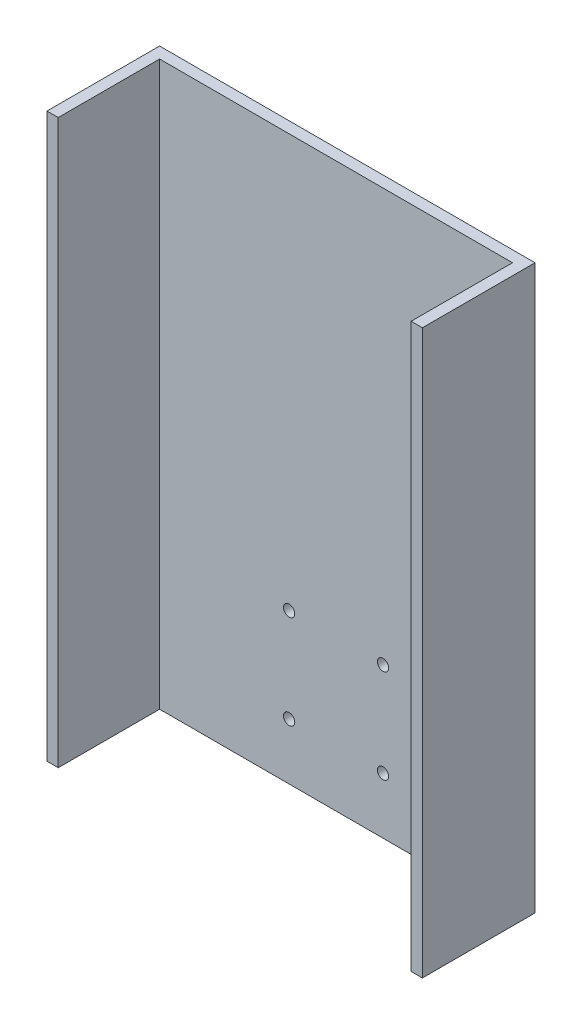
ISO-10303-21;
HEADER;
FILE_DESCRIPTION(('STEP AP214'),'2;1');
FILE_NAME('part.step','',(''),(''),'','','');
FILE_SCHEMA(('AUTOMOTIVE_DESIGN { 1 0 10303 214 1 1 1 1 }'));
ENDSEC;
DATA;
#1=APPLICATION_CONTEXT('core data for automotive mechanical design processes');
#2=APPLICATION_PROTOCOL_DEFINITION('international standard','automotive_design',2000,#1);
#3=PRODUCT_CONTEXT('',#1,'mechanical');
#4=PRODUCT('Part','Part','',(#3));
#5=PRODUCT_RELATED_PRODUCT_CATEGORY('part','',(#4));
#6=PRODUCT_DEFINITION_FORMATION('','',#4);
#7=PRODUCT_DEFINITION_CONTEXT('part definition',#1,'design');
#8=PRODUCT_DEFINITION('design','',#6,#7);
#9=PRODUCT_DEFINITION_SHAPE('','',#8);
#10=(LENGTH_UNIT() NAMED_UNIT(*) SI_UNIT(.MILLI.,.METRE.));
#11=(NAMED_UNIT(*) PLANE_ANGLE_UNIT() SI_UNIT($,.RADIAN.));
#12=(NAMED_UNIT(*) SI_UNIT($,.STERADIAN.) SOLID_ANGLE_UNIT());
#13=UNCERTAINTY_MEASURE_WITH_UNIT(LENGTH_MEASURE(1.E-05),#10,'distance_accuracy_value','');
#14=(GEOMETRIC_REPRESENTATION_CONTEXT(3) GLOBAL_UNCERTAINTY_ASSIGNED_CONTEXT((#13)) GLOBAL_UNIT_ASSIGNED_CONTEXT((#10,
#11,#12)) REPRESENTATION_CONTEXT('',''));
#15=CARTESIAN_POINT('',(0.,0.,0.));
#16=DIRECTION('',(0.,0.,1.));
#17=DIRECTION('',(1.,0.,0.));
#18=AXIS2_PLACEMENT_3D('',#15,#16,#17);
#19=CARTESIAN_POINT('',(0.,0.,30.));
#20=DIRECTION('',(0.,0.,1.));
#21=DIRECTION('',(1.,0.,0.));
#22=AXIS2_PLACEMENT_3D('',#19,#20,#21);
#23=PLANE('',#22);
#24=DIRECTION('',(0.,-1.,0.));
#25=VECTOR('',#24,1.);
#26=CARTESIAN_POINT('',(-47.,-75.,30.));
#27=LINE('',#26,#25);
#28=CARTESIAN_POINT('',(-47.,75.,30.));
#29=VERTEX_POINT('',#28);
#30=CARTESIAN_POINT('',(-47.,-75.,30.));
#31=VERTEX_POINT('',#30);
#32=EDGE_CURVE('E114',#29,#31,#27,.T.);
#33=ORIENTED_EDGE('',*,*,#32,.F.);
#34=DIRECTION('',(-1.,0.,0.));
#35=VECTOR('',#34,1.);
#36=CARTESIAN_POINT('',(50.,75.,30.));
#37=LINE('',#36,#35);
#38=CARTESIAN_POINT('',(-50.,75.,30.));
#39=VERTEX_POINT('',#38);
#40=EDGE_CURVE('E57',#29,#39,#37,.T.);
#41=ORIENTED_EDGE('',*,*,#40,.T.);
#42=DIRECTION('',(0.,-1.,0.));
#43=VECTOR('',#42,1.);
#44=CARTESIAN_POINT('',(-50.,-75.,30.));
#45=LINE('',#44,#43);
#46=CARTESIAN_POINT('',(-50.,-75.,30.));
#47=VERTEX_POINT('',#46);
#48=EDGE_CURVE('E141',#39,#47,#45,.T.);
#49=ORIENTED_EDGE('',*,*,#48,.T.);
#50=DIRECTION('',(1.,0.,0.));
#51=VECTOR('',#50,1.);
#52=CARTESIAN_POINT('',(50.,-75.,30.));
#53=LINE('',#52,#51);
#54=EDGE_CURVE('E86',#47,#31,#53,.T.);
#55=ORIENTED_EDGE('',*,*,#54,.T.);
#56=EDGE_LOOP('',(#33,#41,#49,#55));
#57=FACE_BOUND('',#56,.T.);
#58=ADVANCED_FACE('F33',(#57),#23,.T.);
#59=CARTESIAN_POINT('',(-50.,-75.,30.));
#60=DIRECTION('',(1.,0.,0.));
#61=DIRECTION('',(0.,0.,-1.));
#62=AXIS2_PLACEMENT_3D('',#59,#60,#61);
#63=PLANE('',#62);
#64=DIRECTION('',(0.,-1.,0.));
#65=VECTOR('',#64,1.);
#66=CARTESIAN_POINT('',(-50.,-75.,0.));
#67=LINE('',#66,#65);
#68=CARTESIAN_POINT('',(-50.,75.,0.));
#69=VERTEX_POINT('',#68);
#70=CARTESIAN_POINT('',(-50.,-75.,0.));
#71=VERTEX_POINT('',#70);
#72=EDGE_CURVE('E116',#69,#71,#67,.T.);
#73=ORIENTED_EDGE('',*,*,#72,.T.);
#74=DIRECTION('',(0.,0.,-1.));
#75=VECTOR('',#74,1.);
#76=CARTESIAN_POINT('',(-50.,-75.,30.));
#77=LINE('',#76,#75);
#78=EDGE_CURVE('E11',#47,#71,#77,.T.);
#79=ORIENTED_EDGE('',*,*,#78,.F.);
#80=ORIENTED_EDGE('',*,*,#48,.F.);
#81=DIRECTION('',(0.,0.,-1.));
#82=VECTOR('',#81,1.);
#83=CARTESIAN_POINT('',(-50.,75.,30.));
#84=LINE('',#83,#82);
#85=EDGE_CURVE('E150',#39,#69,#84,.T.);
#86=ORIENTED_EDGE('',*,*,#85,.T.);
#87=EDGE_LOOP('',(#73,#79,#80,#86));
#88=FACE_BOUND('',#87,.T.);
#89=ADVANCED_FACE('F35',(#88),#63,.F.);
#90=CARTESIAN_POINT('',(50.,-75.,30.));
#91=DIRECTION('',(0.,1.,0.));
#92=DIRECTION('',(0.,0.,1.));
#93=AXIS2_PLACEMENT_3D('',#90,#91,#92);
#94=PLANE('',#93);
#95=CARTESIAN_POINT('',(47.,-75.,30.));
#96=VERTEX_POINT('',#95);
#97=CARTESIAN_POINT('',(50.,-75.,30.));
#98=VERTEX_POINT('',#97);
#99=EDGE_CURVE('E143',#96,#98,#53,.T.);
#100=ORIENTED_EDGE('',*,*,#99,.F.);
#101=DIRECTION('',(0.,0.,-1.));
#102=VECTOR('',#101,1.);
#103=CARTESIAN_POINT('',(47.,-75.,30.));
#104=LINE('',#103,#102);
#105=CARTESIAN_POINT('',(47.,-75.,3.));
#106=VERTEX_POINT('',#105);
#107=EDGE_CURVE('E48',#96,#106,#104,.T.);
#108=ORIENTED_EDGE('',*,*,#107,.T.);
#109=DIRECTION('',(1.,0.,0.));
#110=VECTOR('',#109,1.);
#111=CARTESIAN_POINT('',(50.,-75.,3.));
#112=LINE('',#111,#110);
#113=CARTESIAN_POINT('',(-47.,-75.,3.));
#114=VERTEX_POINT('',#113);
#115=EDGE_CURVE('E120',#114,#106,#112,.T.);
#116=ORIENTED_EDGE('',*,*,#115,.F.);
#117=DIRECTION('',(0.,0.,-1.));
#118=VECTOR('',#117,1.);
#119=CARTESIAN_POINT('',(-47.,-75.,30.));
#120=LINE('',#119,#118);
#121=EDGE_CURVE('E109',#31,#114,#120,.T.);
#122=ORIENTED_EDGE('',*,*,#121,.F.);
#123=ORIENTED_EDGE('',*,*,#54,.F.);
#124=ORIENTED_EDGE('',*,*,#78,.T.);
#125=DIRECTION('',(1.,0.,0.));
#126=VECTOR('',#125,1.);
#127=CARTESIAN_POINT('',(50.,-75.,0.));
#128=LINE('',#127,#126);
#129=CARTESIAN_POINT('',(50.,-75.,0.));
#130=VERTEX_POINT('',#129);
#131=EDGE_CURVE('E153',#71,#130,#128,.T.);
#132=ORIENTED_EDGE('',*,*,#131,.T.);
#133=DIRECTION('',(0.,0.,-1.));
#134=VECTOR('',#133,1.);
#135=CARTESIAN_POINT('',(50.,-75.,30.));
#136=LINE('',#135,#134);
#137=EDGE_CURVE('E41',#98,#130,#136,.T.);
#138=ORIENTED_EDGE('',*,*,#137,.F.);
#139=EDGE_LOOP('',(#100,#108,#116,#122,#123,#124,#132,#138));
#140=FACE_BOUND('',#139,.T.);
#141=ADVANCED_FACE('F126',(#140),#94,.F.);
#142=CARTESIAN_POINT('',(50.,-75.,30.));
#143=DIRECTION('',(-1.,0.,0.));
#144=DIRECTION('',(0.,0.,1.));
#145=AXIS2_PLACEMENT_3D('',#142,#143,#144);
#146=PLANE('',#145);
#147=DIRECTION('',(0.,1.,0.));
#148=VECTOR('',#147,1.);
#149=CARTESIAN_POINT('',(50.,-75.,0.));
#150=LINE('',#149,#148);
#151=CARTESIAN_POINT('',(50.,75.,0.));
#152=VERTEX_POINT('',#151);
#153=EDGE_CURVE('E155',#130,#152,#150,.T.);
#154=ORIENTED_EDGE('',*,*,#153,.T.);
#155=DIRECTION('',(0.,0.,-1.));
#156=VECTOR('',#155,1.);
#157=CARTESIAN_POINT('',(50.,75.,30.));
#158=LINE('',#157,#156);
#159=CARTESIAN_POINT('',(50.,75.,30.));
#160=VERTEX_POINT('',#159);
#161=EDGE_CURVE('E159',#160,#152,#158,.T.);
#162=ORIENTED_EDGE('',*,*,#161,.F.);
#163=DIRECTION('',(0.,1.,0.));
#164=VECTOR('',#163,1.);
#165=CARTESIAN_POINT('',(50.,-75.,30.));
#166=LINE('',#165,#164);
#167=EDGE_CURVE('E145',#98,#160,#166,.T.);
#168=ORIENTED_EDGE('',*,*,#167,.F.);
#169=ORIENTED_EDGE('',*,*,#137,.T.);
#170=EDGE_LOOP('',(#154,#162,#168,#169));
#171=FACE_BOUND('',#170,.T.);
#172=ADVANCED_FACE('F165',(#171),#146,.F.);
#173=CARTESIAN_POINT('',(50.,75.,30.));
#174=DIRECTION('',(0.,-1.,0.));
#175=DIRECTION('',(1.,0.,0.));
#176=AXIS2_PLACEMENT_3D('',#173,#174,#175);
#177=PLANE('',#176);
#178=ORIENTED_EDGE('',*,*,#40,.F.);
#179=DIRECTION('',(0.,0.,-1.));
#180=VECTOR('',#179,1.);
#181=CARTESIAN_POINT('',(-47.,75.,30.));
#182=LINE('',#181,#180);
#183=CARTESIAN_POINT('',(-47.,75.,3.));
#184=VERTEX_POINT('',#183);
#185=EDGE_CURVE('E135',#29,#184,#182,.T.);
#186=ORIENTED_EDGE('',*,*,#185,.T.);
#187=DIRECTION('',(-1.,0.,0.));
#188=VECTOR('',#187,1.);
#189=CARTESIAN_POINT('',(50.,75.,3.));
#190=LINE('',#189,#188);
#191=CARTESIAN_POINT('',(47.,75.,3.));
#192=VERTEX_POINT('',#191);
#193=EDGE_CURVE('E122',#192,#184,#190,.T.);
#194=ORIENTED_EDGE('',*,*,#193,.F.);
#195=DIRECTION('',(0.,0.,-1.));
#196=VECTOR('',#195,1.);
#197=CARTESIAN_POINT('',(47.,75.,30.));
#198=LINE('',#197,#196);
#199=CARTESIAN_POINT('',(47.,75.,30.));
#200=VERTEX_POINT('',#199);
#201=EDGE_CURVE('E132',#200,#192,#198,.T.);
#202=ORIENTED_EDGE('',*,*,#201,.F.);
#203=EDGE_CURVE('E147',#160,#200,#37,.T.);
#204=ORIENTED_EDGE('',*,*,#203,.F.);
#205=ORIENTED_EDGE('',*,*,#161,.T.);
#206=DIRECTION('',(-1.,0.,0.));
#207=VECTOR('',#206,1.);
#208=CARTESIAN_POINT('',(50.,75.,0.));
#209=LINE('',#208,#207);
#210=EDGE_CURVE('E79',#152,#69,#209,.T.);
#211=ORIENTED_EDGE('',*,*,#210,.T.);
#212=ORIENTED_EDGE('',*,*,#85,.F.);
#213=EDGE_LOOP('',(#178,#186,#194,#202,#204,#205,#211,#212));
#214=FACE_BOUND('',#213,.T.);
#215=ADVANCED_FACE('F173',(#214),#177,.F.);
#216=DIRECTION('',(0.,1.,0.));
#217=VECTOR('',#216,1.);
#218=CARTESIAN_POINT('',(47.,-75.,30.));
#219=LINE('',#218,#217);
#220=EDGE_CURVE('E133',#96,#200,#219,.T.);
#221=ORIENTED_EDGE('',*,*,#220,.F.);
#222=ORIENTED_EDGE('',*,*,#99,.T.);
#223=ORIENTED_EDGE('',*,*,#167,.T.);
#224=ORIENTED_EDGE('',*,*,#203,.T.);
#225=EDGE_LOOP('',(#221,#222,#223,#224));
#226=FACE_BOUND('',#225,.T.);
#227=ADVANCED_FACE('F177',(#226),#23,.T.);
#228=CARTESIAN_POINT('',(0.,0.,0.));
#229=DIRECTION('',(0.,0.,1.));
#230=DIRECTION('',(1.,0.,0.));
#231=AXIS2_PLACEMENT_3D('',#228,#229,#230);
#232=PLANE('',#231);
#233=CARTESIAN_POINT('',(12.5,-35.,0.));
#234=DIRECTION('',(0.,0.,1.));
#235=DIRECTION('',(1.,0.,0.));
#236=AXIS2_PLACEMENT_3D('',#233,#234,#235);
#237=CIRCLE('',#236,1.5);
#238=CARTESIAN_POINT('',(14.,-35.,0.));
#239=VERTEX_POINT('',#238);
#240=EDGE_CURVE('E237',#239,#239,#237,.F.);
#241=ORIENTED_EDGE('',*,*,#240,.F.);
#242=EDGE_LOOP('',(#241));
#243=FACE_BOUND('',#242,.T.);
#244=CARTESIAN_POINT('',(12.5,-60.,0.));
#245=DIRECTION('',(0.,0.,1.));
#246=DIRECTION('',(1.,0.,0.));
#247=AXIS2_PLACEMENT_3D('',#244,#245,#246);
#248=CIRCLE('',#247,1.5);
#249=CARTESIAN_POINT('',(14.,-60.,0.));
#250=VERTEX_POINT('',#249);
#251=EDGE_CURVE('E231',#250,#250,#248,.F.);
#252=ORIENTED_EDGE('',*,*,#251,.F.);
#253=EDGE_LOOP('',(#252));
#254=FACE_BOUND('',#253,.T.);
#255=CARTESIAN_POINT('',(-12.5,-60.,0.));
#256=DIRECTION('',(0.,0.,1.));
#257=DIRECTION('',(1.,0.,0.));
#258=AXIS2_PLACEMENT_3D('',#255,#256,#257);
#259=CIRCLE('',#258,1.5);
#260=CARTESIAN_POINT('',(-11.,-60.,0.));
#261=VERTEX_POINT('',#260);
#262=EDGE_CURVE('E225',#261,#261,#259,.F.);
#263=ORIENTED_EDGE('',*,*,#262,.F.);
#264=EDGE_LOOP('',(#263));
#265=FACE_BOUND('',#264,.T.);
#266=CARTESIAN_POINT('',(-12.5,-35.,0.));
#267=DIRECTION('',(0.,0.,1.));
#268=DIRECTION('',(1.,0.,0.));
#269=AXIS2_PLACEMENT_3D('',#266,#267,#268);
#270=CIRCLE('',#269,1.5);
#271=CARTESIAN_POINT('',(-11.,-35.,0.));
#272=VERTEX_POINT('',#271);
#273=EDGE_CURVE('E123',#272,#272,#270,.F.);
#274=ORIENTED_EDGE('',*,*,#273,.F.);
#275=EDGE_LOOP('',(#274));
#276=FACE_BOUND('',#275,.T.);
#277=ORIENTED_EDGE('',*,*,#72,.F.);
#278=ORIENTED_EDGE('',*,*,#210,.F.);
#279=ORIENTED_EDGE('',*,*,#153,.F.);
#280=ORIENTED_EDGE('',*,*,#131,.F.);
#281=EDGE_LOOP('',(#277,#278,#279,#280));
#282=FACE_BOUND('',#281,.T.);
#283=ADVANCED_FACE('F169',(#243,#254,#265,#276,#282),#232,.F.);
#284=CARTESIAN_POINT('',(-47.,-75.,30.));
#285=DIRECTION('',(1.,0.,0.));
#286=DIRECTION('',(0.,0.,-1.));
#287=AXIS2_PLACEMENT_3D('',#284,#285,#286);
#288=PLANE('',#287);
#289=DIRECTION('',(0.,-1.,0.));
#290=VECTOR('',#289,1.);
#291=CARTESIAN_POINT('',(-47.,-75.,3.));
#292=LINE('',#291,#290);
#293=EDGE_CURVE('E112',#184,#114,#292,.T.);
#294=ORIENTED_EDGE('',*,*,#293,.F.);
#295=ORIENTED_EDGE('',*,*,#185,.F.);
#296=ORIENTED_EDGE('',*,*,#32,.T.);
#297=ORIENTED_EDGE('',*,*,#121,.T.);
#298=EDGE_LOOP('',(#294,#295,#296,#297));
#299=FACE_BOUND('',#298,.T.);
#300=ADVANCED_FACE('F111',(#299),#288,.T.);
#301=CARTESIAN_POINT('',(47.,-75.,30.));
#302=DIRECTION('',(-1.,0.,0.));
#303=DIRECTION('',(0.,0.,1.));
#304=AXIS2_PLACEMENT_3D('',#301,#302,#303);
#305=PLANE('',#304);
#306=DIRECTION('',(0.,1.,0.));
#307=VECTOR('',#306,1.);
#308=CARTESIAN_POINT('',(47.,-75.,3.));
#309=LINE('',#308,#307);
#310=EDGE_CURVE('E127',#106,#192,#309,.T.);
#311=ORIENTED_EDGE('',*,*,#310,.F.);
#312=ORIENTED_EDGE('',*,*,#107,.F.);
#313=ORIENTED_EDGE('',*,*,#220,.T.);
#314=ORIENTED_EDGE('',*,*,#201,.T.);
#315=EDGE_LOOP('',(#311,#312,#313,#314));
#316=FACE_BOUND('',#315,.T.);
#317=ADVANCED_FACE('F192',(#316),#305,.T.);
#318=CARTESIAN_POINT('',(0.,0.,3.));
#319=DIRECTION('',(0.,0.,1.));
#320=DIRECTION('',(1.,0.,0.));
#321=AXIS2_PLACEMENT_3D('',#318,#319,#320);
#322=PLANE('',#321);
#323=CARTESIAN_POINT('',(12.5,-35.,3.));
#324=DIRECTION('',(0.,0.,1.));
#325=DIRECTION('',(-1.,0.,0.));
#326=AXIS2_PLACEMENT_3D('',#323,#324,#325);
#327=CIRCLE('',#326,1.5);
#328=CARTESIAN_POINT('',(14.,-35.,3.));
#329=VERTEX_POINT('',#328);
#330=EDGE_CURVE('E240',#329,#329,#327,.T.);
#331=ORIENTED_EDGE('',*,*,#330,.F.);
#332=EDGE_LOOP('',(#331));
#333=FACE_BOUND('',#332,.T.);
#334=CARTESIAN_POINT('',(12.5,-60.,3.));
#335=DIRECTION('',(0.,0.,1.));
#336=DIRECTION('',(-1.,0.,0.));
#337=AXIS2_PLACEMENT_3D('',#334,#335,#336);
#338=CIRCLE('',#337,1.5);
#339=CARTESIAN_POINT('',(14.,-60.,3.));
#340=VERTEX_POINT('',#339);
#341=EDGE_CURVE('E234',#340,#340,#338,.T.);
#342=ORIENTED_EDGE('',*,*,#341,.F.);
#343=EDGE_LOOP('',(#342));
#344=FACE_BOUND('',#343,.T.);
#345=CARTESIAN_POINT('',(-12.5,-60.,3.));
#346=DIRECTION('',(0.,0.,1.));
#347=DIRECTION('',(1.,0.,0.));
#348=AXIS2_PLACEMENT_3D('',#345,#346,#347);
#349=CIRCLE('',#348,1.5);
#350=CARTESIAN_POINT('',(-11.,-60.,3.));
#351=VERTEX_POINT('',#350);
#352=EDGE_CURVE('E222',#351,#351,#349,.T.);
#353=ORIENTED_EDGE('',*,*,#352,.F.);
#354=EDGE_LOOP('',(#353));
#355=FACE_BOUND('',#354,.T.);
#356=CARTESIAN_POINT('',(-12.5,-35.,3.));
#357=DIRECTION('',(0.,0.,1.));
#358=DIRECTION('',(1.,0.,0.));
#359=AXIS2_PLACEMENT_3D('',#356,#357,#358);
#360=CIRCLE('',#359,1.5);
#361=CARTESIAN_POINT('',(-11.,-35.,3.));
#362=VERTEX_POINT('',#361);
#363=EDGE_CURVE('E227',#362,#362,#360,.T.);
#364=ORIENTED_EDGE('',*,*,#363,.F.);
#365=EDGE_LOOP('',(#364));
#366=FACE_BOUND('',#365,.T.);
#367=ORIENTED_EDGE('',*,*,#293,.T.);
#368=ORIENTED_EDGE('',*,*,#115,.T.);
#369=ORIENTED_EDGE('',*,*,#310,.T.);
#370=ORIENTED_EDGE('',*,*,#193,.T.);
#371=EDGE_LOOP('',(#367,#368,#369,#370));
#372=FACE_BOUND('',#371,.T.);
#373=ADVANCED_FACE('F119',(#333,#344,#355,#366,#372),#322,.T.);
#374=CARTESIAN_POINT('',(-12.5,-35.,-0.00100000000000013));
#375=DIRECTION('',(0.,0.,1.));
#376=DIRECTION('',(1.,0.,0.));
#377=AXIS2_PLACEMENT_3D('',#374,#375,#376);
#378=CYLINDRICAL_SURFACE('',#377,1.5);
#379=CARTESIAN_POINT('',(-11.,-35.,3.));
#380=CARTESIAN_POINT('',(-11.,-35.,2.96875));
#381=CARTESIAN_POINT('',(-11.,-35.,2.9375));
#382=CARTESIAN_POINT('',(-11.,-35.,2.875));
#383=CARTESIAN_POINT('',(-11.,-35.,2.84375));
#384=CARTESIAN_POINT('',(-11.,-35.,2.78125));
#385=CARTESIAN_POINT('',(-11.,-35.,2.75));
#386=CARTESIAN_POINT('',(-11.,-35.,2.6875));
#387=CARTESIAN_POINT('',(-11.,-35.,2.65625));
#388=CARTESIAN_POINT('',(-11.,-35.,2.59375));
#389=CARTESIAN_POINT('',(-11.,-35.,2.5625));
#390=CARTESIAN_POINT('',(-11.,-35.,2.5));
#391=CARTESIAN_POINT('',(-11.,-35.,2.46875));
#392=CARTESIAN_POINT('',(-11.,-35.,2.40625));
#393=CARTESIAN_POINT('',(-11.,-35.,2.375));
#394=CARTESIAN_POINT('',(-11.,-35.,2.3125));
#395=CARTESIAN_POINT('',(-11.,-35.,2.28125));
#396=CARTESIAN_POINT('',(-11.,-35.,2.21875));
#397=CARTESIAN_POINT('',(-11.,-35.,2.1875));
#398=CARTESIAN_POINT('',(-11.,-35.,2.125));
#399=CARTESIAN_POINT('',(-11.,-35.,2.09375));
#400=CARTESIAN_POINT('',(-11.,-35.,2.03125));
#401=CARTESIAN_POINT('',(-11.,-35.,2.));
#402=CARTESIAN_POINT('',(-11.,-35.,1.9375));
#403=CARTESIAN_POINT('',(-11.,-35.,1.90625));
#404=CARTESIAN_POINT('',(-11.,-35.,1.84375));
#405=CARTESIAN_POINT('',(-11.,-35.,1.8125));
#406=CARTESIAN_POINT('',(-11.,-35.,1.75));
#407=CARTESIAN_POINT('',(-11.,-35.,1.71875));
#408=CARTESIAN_POINT('',(-11.,-35.,1.65625));
#409=CARTESIAN_POINT('',(-11.,-35.,1.625));
#410=CARTESIAN_POINT('',(-11.,-35.,1.5625));
#411=CARTESIAN_POINT('',(-11.,-35.,1.53125));
#412=CARTESIAN_POINT('',(-11.,-35.,1.46875));
#413=CARTESIAN_POINT('',(-11.,-35.,1.4375));
#414=CARTESIAN_POINT('',(-11.,-35.,1.375));
#415=CARTESIAN_POINT('',(-11.,-35.,1.34375));
#416=CARTESIAN_POINT('',(-11.,-35.,1.28125));
#417=CARTESIAN_POINT('',(-11.,-35.,1.25));
#418=CARTESIAN_POINT('',(-11.,-35.,1.1875));
#419=CARTESIAN_POINT('',(-11.,-35.,1.15625));
#420=CARTESIAN_POINT('',(-11.,-35.,1.09375));
#421=CARTESIAN_POINT('',(-11.,-35.,1.0625));
#422=CARTESIAN_POINT('',(-11.,-35.,1.));
#423=CARTESIAN_POINT('',(-11.,-35.,0.96875));
#424=CARTESIAN_POINT('',(-11.,-35.,0.90625));
#425=CARTESIAN_POINT('',(-11.,-35.,0.875));
#426=CARTESIAN_POINT('',(-11.,-35.,0.8125));
#427=CARTESIAN_POINT('',(-11.,-35.,0.78125));
#428=CARTESIAN_POINT('',(-11.,-35.,0.71875));
#429=CARTESIAN_POINT('',(-11.,-35.,0.6875));
#430=CARTESIAN_POINT('',(-11.,-35.,0.625));
#431=CARTESIAN_POINT('',(-11.,-35.,0.59375));
#432=CARTESIAN_POINT('',(-11.,-35.,0.53125));
#433=CARTESIAN_POINT('',(-11.,-35.,0.5));
#434=CARTESIAN_POINT('',(-11.,-35.,0.4375));
#435=CARTESIAN_POINT('',(-11.,-35.,0.40625));
#436=CARTESIAN_POINT('',(-11.,-35.,0.34375));
#437=CARTESIAN_POINT('',(-11.,-35.,0.3125));
#438=CARTESIAN_POINT('',(-11.,-35.,0.25));
#439=CARTESIAN_POINT('',(-11.,-35.,0.21875));
#440=CARTESIAN_POINT('',(-11.,-35.,0.15625));
#441=CARTESIAN_POINT('',(-11.,-35.,0.125));
#442=CARTESIAN_POINT('',(-11.,-35.,0.0625000000000001));
#443=CARTESIAN_POINT('',(-11.,-35.,0.0312500000000001));
#444=CARTESIAN_POINT('',(-11.,-35.,0.));
#445=B_SPLINE_CURVE_WITH_KNOTS('',3,(#379,#380,#381,#382,#383,#384,#385,#386,#387,#388,#389,
#390,#391,#392,#393,#394,#395,#396,#397,#398,#399,#400,#401,#402,#403,#404,#405,#406,#407,#408,
#409,#410,#411,#412,#413,#414,#415,#416,#417,#418,#419,#420,#421,#422,#423,#424,#425,#426,#427,
#428,#429,#430,#431,#432,#433,#434,#435,#436,#437,#438,#439,#440,#441,#442,#443,#444),
.UNSPECIFIED.,.F.,.F.,(4,2,2,2,2,2,2,2,2,2,2,2,2,2,2,2,2,2,2,2,2,2,2,2,2,2,2,2,2,2,2,2,4),(0.,
0.0937500000000001,0.1875,0.28125,0.375,0.46875,0.5625,0.65625,0.75,0.84375,0.9375,1.03125,
1.125,1.21875,1.3125,1.40625,1.5,1.59375,1.6875,1.78125,1.875,1.96875,2.0625,2.15625,2.25,
2.34375,2.4375,2.53125,2.625,2.71875,2.8125,2.90625,3.),.UNSPECIFIED.);
#446=EDGE_CURVE('BSEAM199',#362,#272,#445,.T.);
#447=ORIENTED_EDGE('',*,*,#363,.T.);
#448=ORIENTED_EDGE('',*,*,#273,.T.);
#449=ORIENTED_EDGE('',*,*,#446,.T.);
#450=ORIENTED_EDGE('',*,*,#446,.F.);
#451=EDGE_LOOP('',(#447,#449,#448,#450));
#452=FACE_BOUND('',#451,.T.);
#453=ADVANCED_FACE('F199',(#452),#378,.F.);
#454=CARTESIAN_POINT('',(-12.5,-60.,-0.00100000000000013));
#455=DIRECTION('',(0.,0.,1.));
#456=DIRECTION('',(1.,0.,0.));
#457=AXIS2_PLACEMENT_3D('',#454,#455,#456);
#458=CYLINDRICAL_SURFACE('',#457,1.5);
#459=CARTESIAN_POINT('',(-11.,-60.,3.));
#460=CARTESIAN_POINT('',(-11.,-60.,2.96875));
#461=CARTESIAN_POINT('',(-11.,-60.,2.9375));
#462=CARTESIAN_POINT('',(-11.,-60.,2.875));
#463=CARTESIAN_POINT('',(-11.,-60.,2.84375));
#464=CARTESIAN_POINT('',(-11.,-60.,2.78125));
#465=CARTESIAN_POINT('',(-11.,-60.,2.75));
#466=CARTESIAN_POINT('',(-11.,-60.,2.6875));
#467=CARTESIAN_POINT('',(-11.,-60.,2.65625));
#468=CARTESIAN_POINT('',(-11.,-60.,2.59375));
#469=CARTESIAN_POINT('',(-11.,-60.,2.5625));
#470=CARTESIAN_POINT('',(-11.,-60.,2.5));
#471=CARTESIAN_POINT('',(-11.,-60.,2.46875));
#472=CARTESIAN_POINT('',(-11.,-60.,2.40625));
#473=CARTESIAN_POINT('',(-11.,-60.,2.375));
#474=CARTESIAN_POINT('',(-11.,-60.,2.3125));
#475=CARTESIAN_POINT('',(-11.,-60.,2.28125));
#476=CARTESIAN_POINT('',(-11.,-60.,2.21875));
#477=CARTESIAN_POINT('',(-11.,-60.,2.1875));
#478=CARTESIAN_POINT('',(-11.,-60.,2.125));
#479=CARTESIAN_POINT('',(-11.,-60.,2.09375));
#480=CARTESIAN_POINT('',(-11.,-60.,2.03125));
#481=CARTESIAN_POINT('',(-11.,-60.,2.));
#482=CARTESIAN_POINT('',(-11.,-60.,1.9375));
#483=CARTESIAN_POINT('',(-11.,-60.,1.90625));
#484=CARTESIAN_POINT('',(-11.,-60.,1.84375));
#485=CARTESIAN_POINT('',(-11.,-60.,1.8125));
#486=CARTESIAN_POINT('',(-11.,-60.,1.75));
#487=CARTESIAN_POINT('',(-11.,-60.,1.71875));
#488=CARTESIAN_POINT('',(-11.,-60.,1.65625));
#489=CARTESIAN_POINT('',(-11.,-60.,1.625));
#490=CARTESIAN_POINT('',(-11.,-60.,1.5625));
#491=CARTESIAN_POINT('',(-11.,-60.,1.53125));
#492=CARTESIAN_POINT('',(-11.,-60.,1.46875));
#493=CARTESIAN_POINT('',(-11.,-60.,1.4375));
#494=CARTESIAN_POINT('',(-11.,-60.,1.375));
#495=CARTESIAN_POINT('',(-11.,-60.,1.34375));
#496=CARTESIAN_POINT('',(-11.,-60.,1.28125));
#497=CARTESIAN_POINT('',(-11.,-60.,1.25));
#498=CARTESIAN_POINT('',(-11.,-60.,1.1875));
#499=CARTESIAN_POINT('',(-11.,-60.,1.15625));
#500=CARTESIAN_POINT('',(-11.,-60.,1.09375));
#501=CARTESIAN_POINT('',(-11.,-60.,1.0625));
#502=CARTESIAN_POINT('',(-11.,-60.,1.));
#503=CARTESIAN_POINT('',(-11.,-60.,0.96875));
#504=CARTESIAN_POINT('',(-11.,-60.,0.90625));
#505=CARTESIAN_POINT('',(-11.,-60.,0.875));
#506=CARTESIAN_POINT('',(-11.,-60.,0.8125));
#507=CARTESIAN_POINT('',(-11.,-60.,0.78125));
#508=CARTESIAN_POINT('',(-11.,-60.,0.71875));
#509=CARTESIAN_POINT('',(-11.,-60.,0.6875));
#510=CARTESIAN_POINT('',(-11.,-60.,0.625));
#511=CARTESIAN_POINT('',(-11.,-60.,0.59375));
#512=CARTESIAN_POINT('',(-11.,-60.,0.53125));
#513=CARTESIAN_POINT('',(-11.,-60.,0.5));
#514=CARTESIAN_POINT('',(-11.,-60.,0.4375));
#515=CARTESIAN_POINT('',(-11.,-60.,0.40625));
#516=CARTESIAN_POINT('',(-11.,-60.,0.34375));
#517=CARTESIAN_POINT('',(-11.,-60.,0.3125));
#518=CARTESIAN_POINT('',(-11.,-60.,0.25));
#519=CARTESIAN_POINT('',(-11.,-60.,0.21875));
#520=CARTESIAN_POINT('',(-11.,-60.,0.15625));
#521=CARTESIAN_POINT('',(-11.,-60.,0.125));
#522=CARTESIAN_POINT('',(-11.,-60.,0.0625000000000001));
#523=CARTESIAN_POINT('',(-11.,-60.,0.0312500000000001));
#524=CARTESIAN_POINT('',(-11.,-60.,0.));
#525=B_SPLINE_CURVE_WITH_KNOTS('',3,(#459,#460,#461,#462,#463,#464,#465,#466,#467,#468,#469,
#470,#471,#472,#473,#474,#475,#476,#477,#478,#479,#480,#481,#482,#483,#484,#485,#486,#487,#488,
#489,#490,#491,#492,#493,#494,#495,#496,#497,#498,#499,#500,#501,#502,#503,#504,#505,#506,#507,
#508,#509,#510,#511,#512,#513,#514,#515,#516,#517,#518,#519,#520,#521,#522,#523,#524),
.UNSPECIFIED.,.F.,.F.,(4,2,2,2,2,2,2,2,2,2,2,2,2,2,2,2,2,2,2,2,2,2,2,2,2,2,2,2,2,2,2,2,4),(0.,
0.0937500000000001,0.1875,0.28125,0.375,0.46875,0.5625,0.65625,0.75,0.84375,0.9375,1.03125,
1.125,1.21875,1.3125,1.40625,1.5,1.59375,1.6875,1.78125,1.875,1.96875,2.0625,2.15625,2.25,
2.34375,2.4375,2.53125,2.625,2.71875,2.8125,2.90625,3.),.UNSPECIFIED.);
#526=EDGE_CURVE('BSEAM205',#351,#261,#525,.T.);
#527=ORIENTED_EDGE('',*,*,#352,.T.);
#528=ORIENTED_EDGE('',*,*,#262,.T.);
#529=ORIENTED_EDGE('',*,*,#526,.T.);
#530=ORIENTED_EDGE('',*,*,#526,.F.);
#531=EDGE_LOOP('',(#527,#529,#528,#530));
#532=FACE_BOUND('',#531,.T.);
#533=ADVANCED_FACE('F205',(#532),#458,.F.);
#534=CARTESIAN_POINT('',(12.5,-60.,-0.00100000000000013));
#535=DIRECTION('',(0.,0.,1.));
#536=DIRECTION('',(1.,0.,0.));
#537=AXIS2_PLACEMENT_3D('',#534,#535,#536);
#538=CYLINDRICAL_SURFACE('',#537,1.5);
#539=CARTESIAN_POINT('',(14.,-60.,3.));
#540=CARTESIAN_POINT('',(14.,-60.,2.96875));
#541=CARTESIAN_POINT('',(14.,-60.,2.9375));
#542=CARTESIAN_POINT('',(14.,-60.,2.875));
#543=CARTESIAN_POINT('',(14.,-60.,2.84375));
#544=CARTESIAN_POINT('',(14.,-60.,2.78125));
#545=CARTESIAN_POINT('',(14.,-60.,2.75));
#546=CARTESIAN_POINT('',(14.,-60.,2.6875));
#547=CARTESIAN_POINT('',(14.,-60.,2.65625));
#548=CARTESIAN_POINT('',(14.,-60.,2.59375));
#549=CARTESIAN_POINT('',(14.,-60.,2.5625));
#550=CARTESIAN_POINT('',(14.,-60.,2.5));
#551=CARTESIAN_POINT('',(14.,-60.,2.46875));
#552=CARTESIAN_POINT('',(14.,-60.,2.40625));
#553=CARTESIAN_POINT('',(14.,-60.,2.375));
#554=CARTESIAN_POINT('',(14.,-60.,2.3125));
#555=CARTESIAN_POINT('',(14.,-60.,2.28125));
#556=CARTESIAN_POINT('',(14.,-60.,2.21875));
#557=CARTESIAN_POINT('',(14.,-60.,2.1875));
#558=CARTESIAN_POINT('',(14.,-60.,2.125));
#559=CARTESIAN_POINT('',(14.,-60.,2.09375));
#560=CARTESIAN_POINT('',(14.,-60.,2.03125));
#561=CARTESIAN_POINT('',(14.,-60.,2.));
#562=CARTESIAN_POINT('',(14.,-60.,1.9375));
#563=CARTESIAN_POINT('',(14.,-60.,1.90625));
#564=CARTESIAN_POINT('',(14.,-60.,1.84375));
#565=CARTESIAN_POINT('',(14.,-60.,1.8125));
#566=CARTESIAN_POINT('',(14.,-60.,1.75));
#567=CARTESIAN_POINT('',(14.,-60.,1.71875));
#568=CARTESIAN_POINT('',(14.,-60.,1.65625));
#569=CARTESIAN_POINT('',(14.,-60.,1.625));
#570=CARTESIAN_POINT('',(14.,-60.,1.5625));
#571=CARTESIAN_POINT('',(14.,-60.,1.53125));
#572=CARTESIAN_POINT('',(14.,-60.,1.46875));
#573=CARTESIAN_POINT('',(14.,-60.,1.4375));
#574=CARTESIAN_POINT('',(14.,-60.,1.375));
#575=CARTESIAN_POINT('',(14.,-60.,1.34375));
#576=CARTESIAN_POINT('',(14.,-60.,1.28125));
#577=CARTESIAN_POINT('',(14.,-60.,1.25));
#578=CARTESIAN_POINT('',(14.,-60.,1.1875));
#579=CARTESIAN_POINT('',(14.,-60.,1.15625));
#580=CARTESIAN_POINT('',(14.,-60.,1.09375));
#581=CARTESIAN_POINT('',(14.,-60.,1.0625));
#582=CARTESIAN_POINT('',(14.,-60.,1.));
#583=CARTESIAN_POINT('',(14.,-60.,0.96875));
#584=CARTESIAN_POINT('',(14.,-60.,0.90625));
#585=CARTESIAN_POINT('',(14.,-60.,0.875));
#586=CARTESIAN_POINT('',(14.,-60.,0.8125));
#587=CARTESIAN_POINT('',(14.,-60.,0.78125));
#588=CARTESIAN_POINT('',(14.,-60.,0.71875));
#589=CARTESIAN_POINT('',(14.,-60.,0.6875));
#590=CARTESIAN_POINT('',(14.,-60.,0.625));
#591=CARTESIAN_POINT('',(14.,-60.,0.59375));
#592=CARTESIAN_POINT('',(14.,-60.,0.53125));
#593=CARTESIAN_POINT('',(14.,-60.,0.5));
#594=CARTESIAN_POINT('',(14.,-60.,0.4375));
#595=CARTESIAN_POINT('',(14.,-60.,0.40625));
#596=CARTESIAN_POINT('',(14.,-60.,0.34375));
#597=CARTESIAN_POINT('',(14.,-60.,0.3125));
#598=CARTESIAN_POINT('',(14.,-60.,0.25));
#599=CARTESIAN_POINT('',(14.,-60.,0.21875));
#600=CARTESIAN_POINT('',(14.,-60.,0.15625));
#601=CARTESIAN_POINT('',(14.,-60.,0.125));
#602=CARTESIAN_POINT('',(14.,-60.,0.0625000000000001));
#603=CARTESIAN_POINT('',(14.,-60.,0.0312500000000001));
#604=CARTESIAN_POINT('',(14.,-60.,0.));
#605=B_SPLINE_CURVE_WITH_KNOTS('',3,(#539,#540,#541,#542,#543,#544,#545,#546,#547,#548,#549,
#550,#551,#552,#553,#554,#555,#556,#557,#558,#559,#560,#561,#562,#563,#564,#565,#566,#567,#568,
#569,#570,#571,#572,#573,#574,#575,#576,#577,#578,#579,#580,#581,#582,#583,#584,#585,#586,#587,
#588,#589,#590,#591,#592,#593,#594,#595,#596,#597,#598,#599,#600,#601,#602,#603,#604),
.UNSPECIFIED.,.F.,.F.,(4,2,2,2,2,2,2,2,2,2,2,2,2,2,2,2,2,2,2,2,2,2,2,2,2,2,2,2,2,2,2,2,4),(0.,
0.0937500000000001,0.1875,0.28125,0.375,0.46875,0.5625,0.65625,0.75,0.84375,0.9375,1.03125,
1.125,1.21875,1.3125,1.40625,1.5,1.59375,1.6875,1.78125,1.875,1.96875,2.0625,2.15625,2.25,
2.34375,2.4375,2.53125,2.625,2.71875,2.8125,2.90625,3.),.UNSPECIFIED.);
#606=EDGE_CURVE('BSEAM210',#340,#250,#605,.T.);
#607=ORIENTED_EDGE('',*,*,#341,.T.);
#608=ORIENTED_EDGE('',*,*,#251,.T.);
#609=ORIENTED_EDGE('',*,*,#606,.T.);
#610=ORIENTED_EDGE('',*,*,#606,.F.);
#611=EDGE_LOOP('',(#607,#609,#608,#610));
#612=FACE_BOUND('',#611,.T.);
#613=ADVANCED_FACE('F210',(#612),#538,.F.);
#614=CARTESIAN_POINT('',(12.5,-35.,-0.00100000000000013));
#615=DIRECTION('',(0.,0.,1.));
#616=DIRECTION('',(1.,0.,0.));
#617=AXIS2_PLACEMENT_3D('',#614,#615,#616);
#618=CYLINDRICAL_SURFACE('',#617,1.5);
#619=CARTESIAN_POINT('',(14.,-35.,3.));
#620=CARTESIAN_POINT('',(14.,-35.,2.96875));
#621=CARTESIAN_POINT('',(14.,-35.,2.9375));
#622=CARTESIAN_POINT('',(14.,-35.,2.875));
#623=CARTESIAN_POINT('',(14.,-35.,2.84375));
#624=CARTESIAN_POINT('',(14.,-35.,2.78125));
#625=CARTESIAN_POINT('',(14.,-35.,2.75));
#626=CARTESIAN_POINT('',(14.,-35.,2.6875));
#627=CARTESIAN_POINT('',(14.,-35.,2.65625));
#628=CARTESIAN_POINT('',(14.,-35.,2.59375));
#629=CARTESIAN_POINT('',(14.,-35.,2.5625));
#630=CARTESIAN_POINT('',(14.,-35.,2.5));
#631=CARTESIAN_POINT('',(14.,-35.,2.46875));
#632=CARTESIAN_POINT('',(14.,-35.,2.40625));
#633=CARTESIAN_POINT('',(14.,-35.,2.375));
#634=CARTESIAN_POINT('',(14.,-35.,2.3125));
#635=CARTESIAN_POINT('',(14.,-35.,2.28125));
#636=CARTESIAN_POINT('',(14.,-35.,2.21875));
#637=CARTESIAN_POINT('',(14.,-35.,2.1875));
#638=CARTESIAN_POINT('',(14.,-35.,2.125));
#639=CARTESIAN_POINT('',(14.,-35.,2.09375));
#640=CARTESIAN_POINT('',(14.,-35.,2.03125));
#641=CARTESIAN_POINT('',(14.,-35.,2.));
#642=CARTESIAN_POINT('',(14.,-35.,1.9375));
#643=CARTESIAN_POINT('',(14.,-35.,1.90625));
#644=CARTESIAN_POINT('',(14.,-35.,1.84375));
#645=CARTESIAN_POINT('',(14.,-35.,1.8125));
#646=CARTESIAN_POINT('',(14.,-35.,1.75));
#647=CARTESIAN_POINT('',(14.,-35.,1.71875));
#648=CARTESIAN_POINT('',(14.,-35.,1.65625));
#649=CARTESIAN_POINT('',(14.,-35.,1.625));
#650=CARTESIAN_POINT('',(14.,-35.,1.5625));
#651=CARTESIAN_POINT('',(14.,-35.,1.53125));
#652=CARTESIAN_POINT('',(14.,-35.,1.46875));
#653=CARTESIAN_POINT('',(14.,-35.,1.4375));
#654=CARTESIAN_POINT('',(14.,-35.,1.375));
#655=CARTESIAN_POINT('',(14.,-35.,1.34375));
#656=CARTESIAN_POINT('',(14.,-35.,1.28125));
#657=CARTESIAN_POINT('',(14.,-35.,1.25));
#658=CARTESIAN_POINT('',(14.,-35.,1.1875));
#659=CARTESIAN_POINT('',(14.,-35.,1.15625));
#660=CARTESIAN_POINT('',(14.,-35.,1.09375));
#661=CARTESIAN_POINT('',(14.,-35.,1.0625));
#662=CARTESIAN_POINT('',(14.,-35.,1.));
#663=CARTESIAN_POINT('',(14.,-35.,0.96875));
#664=CARTESIAN_POINT('',(14.,-35.,0.90625));
#665=CARTESIAN_POINT('',(14.,-35.,0.875));
#666=CARTESIAN_POINT('',(14.,-35.,0.8125));
#667=CARTESIAN_POINT('',(14.,-35.,0.78125));
#668=CARTESIAN_POINT('',(14.,-35.,0.71875));
#669=CARTESIAN_POINT('',(14.,-35.,0.6875));
#670=CARTESIAN_POINT('',(14.,-35.,0.625));
#671=CARTESIAN_POINT('',(14.,-35.,0.59375));
#672=CARTESIAN_POINT('',(14.,-35.,0.53125));
#673=CARTESIAN_POINT('',(14.,-35.,0.5));
#674=CARTESIAN_POINT('',(14.,-35.,0.4375));
#675=CARTESIAN_POINT('',(14.,-35.,0.40625));
#676=CARTESIAN_POINT('',(14.,-35.,0.34375));
#677=CARTESIAN_POINT('',(14.,-35.,0.3125));
#678=CARTESIAN_POINT('',(14.,-35.,0.25));
#679=CARTESIAN_POINT('',(14.,-35.,0.21875));
#680=CARTESIAN_POINT('',(14.,-35.,0.15625));
#681=CARTESIAN_POINT('',(14.,-35.,0.125));
#682=CARTESIAN_POINT('',(14.,-35.,0.0625000000000001));
#683=CARTESIAN_POINT('',(14.,-35.,0.0312500000000001));
#684=CARTESIAN_POINT('',(14.,-35.,0.));
#685=B_SPLINE_CURVE_WITH_KNOTS('',3,(#619,#620,#621,#622,#623,#624,#625,#626,#627,#628,#629,
#630,#631,#632,#633,#634,#635,#636,#637,#638,#639,#640,#641,#642,#643,#644,#645,#646,#647,#648,
#649,#650,#651,#652,#653,#654,#655,#656,#657,#658,#659,#660,#661,#662,#663,#664,#665,#666,#667,
#668,#669,#670,#671,#672,#673,#674,#675,#676,#677,#678,#679,#680,#681,#682,#683,#684),
.UNSPECIFIED.,.F.,.F.,(4,2,2,2,2,2,2,2,2,2,2,2,2,2,2,2,2,2,2,2,2,2,2,2,2,2,2,2,2,2,2,2,4),(0.,
0.0937500000000001,0.1875,0.28125,0.375,0.46875,0.5625,0.65625,0.75,0.84375,0.9375,1.03125,
1.125,1.21875,1.3125,1.40625,1.5,1.59375,1.6875,1.78125,1.875,1.96875,2.0625,2.15625,2.25,
2.34375,2.4375,2.53125,2.625,2.71875,2.8125,2.90625,3.),.UNSPECIFIED.);
#686=EDGE_CURVE('BSEAM207',#329,#239,#685,.T.);
#687=ORIENTED_EDGE('',*,*,#330,.T.);
#688=ORIENTED_EDGE('',*,*,#240,.T.);
#689=ORIENTED_EDGE('',*,*,#686,.T.);
#690=ORIENTED_EDGE('',*,*,#686,.F.);
#691=EDGE_LOOP('',(#687,#689,#688,#690));
#692=FACE_BOUND('',#691,.T.);
#693=ADVANCED_FACE('F207',(#692),#618,.F.);
#694=CLOSED_SHELL('',(#58,#89,#141,#172,#215,#227,#283,#300,#317,#373,#453,#533,#613,#693));
#695=MANIFOLD_SOLID_BREP('B2',#694);
#696=ADVANCED_BREP_SHAPE_REPRESENTATION('',(#18,#695),#14);
#697=SHAPE_DEFINITION_REPRESENTATION(#9,#696);
ENDSEC;
END-ISO-10303-21;
